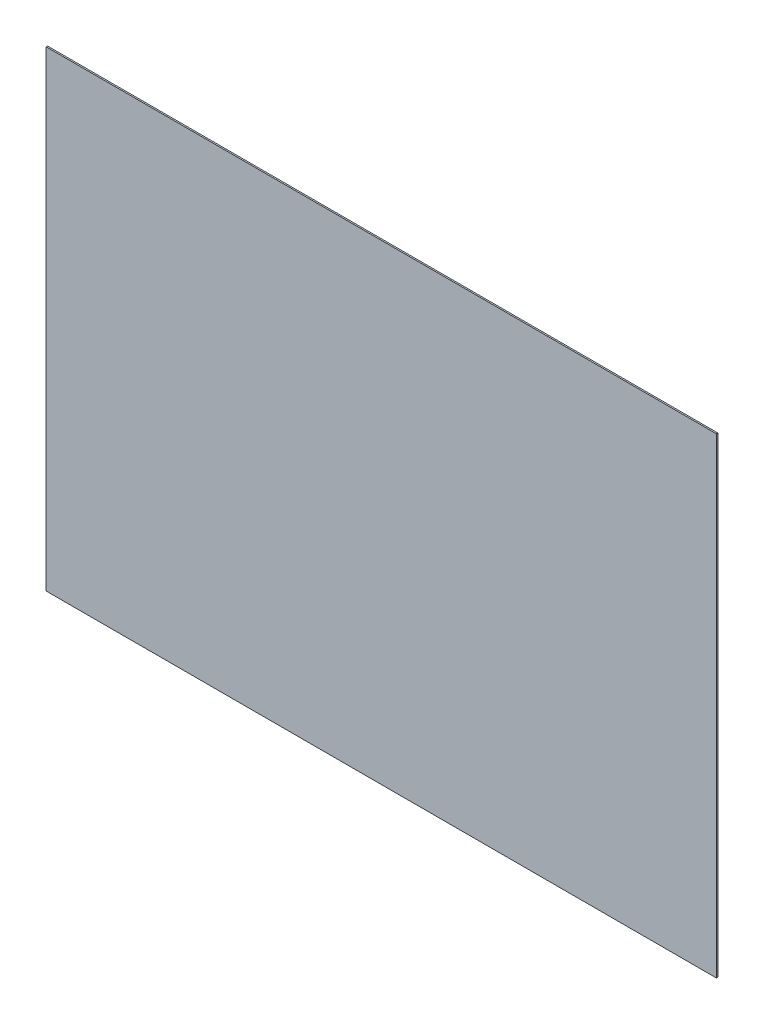
ISO-10303-21;
HEADER;
FILE_DESCRIPTION(('STEP AP214'),'2;1');
FILE_NAME('part.step','',(''),(''),'','','');
FILE_SCHEMA(('AUTOMOTIVE_DESIGN { 1 0 10303 214 1 1 1 1 }'));
ENDSEC;
DATA;
#1=APPLICATION_CONTEXT('core data for automotive mechanical design processes');
#2=APPLICATION_PROTOCOL_DEFINITION('international standard','automotive_design',2000,#1);
#3=PRODUCT_CONTEXT('',#1,'mechanical');
#4=PRODUCT('Part','Part','',(#3));
#5=PRODUCT_RELATED_PRODUCT_CATEGORY('part','',(#4));
#6=PRODUCT_DEFINITION_FORMATION('','',#4);
#7=PRODUCT_DEFINITION_CONTEXT('part definition',#1,'design');
#8=PRODUCT_DEFINITION('design','',#6,#7);
#9=PRODUCT_DEFINITION_SHAPE('','',#8);
#10=(LENGTH_UNIT() NAMED_UNIT(*) SI_UNIT(.MILLI.,.METRE.));
#11=(NAMED_UNIT(*) PLANE_ANGLE_UNIT() SI_UNIT($,.RADIAN.));
#12=(NAMED_UNIT(*) SI_UNIT($,.STERADIAN.) SOLID_ANGLE_UNIT());
#13=UNCERTAINTY_MEASURE_WITH_UNIT(LENGTH_MEASURE(1.E-05),#10,'distance_accuracy_value','');
#14=(GEOMETRIC_REPRESENTATION_CONTEXT(3) GLOBAL_UNCERTAINTY_ASSIGNED_CONTEXT((#13)) GLOBAL_UNIT_ASSIGNED_CONTEXT((#10,
#11,#12)) REPRESENTATION_CONTEXT('',''));
#15=CARTESIAN_POINT('',(0.,0.,0.));
#16=DIRECTION('',(0.,0.,1.));
#17=DIRECTION('',(1.,0.,0.));
#18=AXIS2_PLACEMENT_3D('',#15,#16,#17);
#19=CARTESIAN_POINT('',(54.8004201680672,254.254201680672,1.));
#20=DIRECTION('',(-1.,0.,0.));
#21=DIRECTION('',(0.,-1.,0.));
#22=AXIS2_PLACEMENT_3D('',#19,#20,#21);
#23=PLANE('',#22);
#24=DIRECTION('',(0.,1.,0.));
#25=VECTOR('',#24,1.);
#26=CARTESIAN_POINT('',(54.8004201680672,254.254201680672,0.));
#27=LINE('',#26,#25);
#28=CARTESIAN_POINT('',(54.8004201680672,-76.2457983193278,0.));
#29=VERTEX_POINT('',#28);
#30=CARTESIAN_POINT('',(54.8004201680672,254.254201680672,0.));
#31=VERTEX_POINT('',#30);
#32=EDGE_CURVE('E103',#29,#31,#27,.T.);
#33=ORIENTED_EDGE('',*,*,#32,.T.);
#34=DIRECTION('',(0.,0.,-1.));
#35=VECTOR('',#34,1.);
#36=CARTESIAN_POINT('',(54.8004201680672,254.254201680672,1.));
#37=LINE('',#36,#35);
#38=CARTESIAN_POINT('',(54.8004201680672,254.254201680672,1.));
#39=VERTEX_POINT('',#38);
#40=EDGE_CURVE('E11',#39,#31,#37,.T.);
#41=ORIENTED_EDGE('',*,*,#40,.F.);
#42=DIRECTION('',(0.,1.,0.));
#43=VECTOR('',#42,1.);
#44=CARTESIAN_POINT('',(54.8004201680672,254.254201680672,1.));
#45=LINE('',#44,#43);
#46=CARTESIAN_POINT('',(54.8004201680672,-76.2457983193278,1.));
#47=VERTEX_POINT('',#46);
#48=EDGE_CURVE('E91',#47,#39,#45,.T.);
#49=ORIENTED_EDGE('',*,*,#48,.F.);
#50=DIRECTION('',(0.,0.,-1.));
#51=VECTOR('',#50,1.);
#52=CARTESIAN_POINT('',(54.8004201680672,-76.2457983193278,1.));
#53=LINE('',#52,#51);
#54=EDGE_CURVE('E99',#47,#29,#53,.T.);
#55=ORIENTED_EDGE('',*,*,#54,.T.);
#56=EDGE_LOOP('',(#33,#41,#49,#55));
#57=FACE_BOUND('',#56,.T.);
#58=ADVANCED_FACE('F40',(#57),#23,.F.);
#59=CARTESIAN_POINT('',(-415.199579831933,254.254201680672,1.));
#60=DIRECTION('',(0.,-1.,0.));
#61=DIRECTION('',(0.,0.,-1.));
#62=AXIS2_PLACEMENT_3D('',#59,#60,#61);
#63=PLANE('',#62);
#64=DIRECTION('',(-1.,0.,0.));
#65=VECTOR('',#64,1.);
#66=CARTESIAN_POINT('',(-415.199579831933,254.254201680672,0.));
#67=LINE('',#66,#65);
#68=CARTESIAN_POINT('',(-415.199579831933,254.254201680672,0.));
#69=VERTEX_POINT('',#68);
#70=EDGE_CURVE('E95',#31,#69,#67,.T.);
#71=ORIENTED_EDGE('',*,*,#70,.T.);
#72=DIRECTION('',(0.,0.,-1.));
#73=VECTOR('',#72,1.);
#74=CARTESIAN_POINT('',(-415.199579831933,254.254201680672,1.));
#75=LINE('',#74,#73);
#76=CARTESIAN_POINT('',(-415.199579831933,254.254201680672,1.));
#77=VERTEX_POINT('',#76);
#78=EDGE_CURVE('E48',#77,#69,#75,.T.);
#79=ORIENTED_EDGE('',*,*,#78,.F.);
#80=DIRECTION('',(-1.,0.,0.));
#81=VECTOR('',#80,1.);
#82=CARTESIAN_POINT('',(-415.199579831933,254.254201680672,1.));
#83=LINE('',#82,#81);
#84=EDGE_CURVE('E86',#39,#77,#83,.T.);
#85=ORIENTED_EDGE('',*,*,#84,.F.);
#86=ORIENTED_EDGE('',*,*,#40,.T.);
#87=EDGE_LOOP('',(#71,#79,#85,#86));
#88=FACE_BOUND('',#87,.T.);
#89=ADVANCED_FACE('F94',(#88),#63,.F.);
#90=CARTESIAN_POINT('',(-415.199579831933,254.254201680672,1.));
#91=DIRECTION('',(1.,0.,0.));
#92=DIRECTION('',(0.,1.,0.));
#93=AXIS2_PLACEMENT_3D('',#90,#91,#92);
#94=PLANE('',#93);
#95=DIRECTION('',(0.,-1.,0.));
#96=VECTOR('',#95,1.);
#97=CARTESIAN_POINT('',(-415.199579831933,254.254201680672,0.));
#98=LINE('',#97,#96);
#99=CARTESIAN_POINT('',(-415.199579831933,-76.2457983193278,0.));
#100=VERTEX_POINT('',#99);
#101=EDGE_CURVE('E73',#69,#100,#98,.T.);
#102=ORIENTED_EDGE('',*,*,#101,.T.);
#103=DIRECTION('',(0.,0.,-1.));
#104=VECTOR('',#103,1.);
#105=CARTESIAN_POINT('',(-415.199579831933,-76.2457983193278,1.));
#106=LINE('',#105,#104);
#107=CARTESIAN_POINT('',(-415.199579831933,-76.2457983193278,1.));
#108=VERTEX_POINT('',#107);
#109=EDGE_CURVE('E96',#108,#100,#106,.T.);
#110=ORIENTED_EDGE('',*,*,#109,.F.);
#111=DIRECTION('',(0.,-1.,0.));
#112=VECTOR('',#111,1.);
#113=CARTESIAN_POINT('',(-415.199579831933,254.254201680672,1.));
#114=LINE('',#113,#112);
#115=EDGE_CURVE('E89',#77,#108,#114,.T.);
#116=ORIENTED_EDGE('',*,*,#115,.F.);
#117=ORIENTED_EDGE('',*,*,#78,.T.);
#118=EDGE_LOOP('',(#102,#110,#116,#117));
#119=FACE_BOUND('',#118,.T.);
#120=ADVANCED_FACE('F97',(#119),#94,.F.);
#121=CARTESIAN_POINT('',(-415.199579831933,-76.2457983193278,1.));
#122=DIRECTION('',(0.,1.,0.));
#123=DIRECTION('',(0.,0.,1.));
#124=AXIS2_PLACEMENT_3D('',#121,#122,#123);
#125=PLANE('',#124);
#126=DIRECTION('',(1.,0.,0.));
#127=VECTOR('',#126,1.);
#128=CARTESIAN_POINT('',(-415.199579831933,-76.2457983193278,0.));
#129=LINE('',#128,#127);
#130=EDGE_CURVE('E79',#100,#29,#129,.T.);
#131=ORIENTED_EDGE('',*,*,#130,.T.);
#132=ORIENTED_EDGE('',*,*,#54,.F.);
#133=DIRECTION('',(1.,0.,0.));
#134=VECTOR('',#133,1.);
#135=CARTESIAN_POINT('',(-415.199579831933,-76.2457983193278,1.));
#136=LINE('',#135,#134);
#137=EDGE_CURVE('E56',#108,#47,#136,.T.);
#138=ORIENTED_EDGE('',*,*,#137,.F.);
#139=ORIENTED_EDGE('',*,*,#109,.T.);
#140=EDGE_LOOP('',(#131,#132,#138,#139));
#141=FACE_BOUND('',#140,.T.);
#142=ADVANCED_FACE('F110',(#141),#125,.F.);
#143=CARTESIAN_POINT('',(0.,0.,1.));
#144=DIRECTION('',(0.,0.,1.));
#145=DIRECTION('',(1.,0.,0.));
#146=AXIS2_PLACEMENT_3D('',#143,#144,#145);
#147=PLANE('',#146);
#148=ORIENTED_EDGE('',*,*,#48,.T.);
#149=ORIENTED_EDGE('',*,*,#84,.T.);
#150=ORIENTED_EDGE('',*,*,#115,.T.);
#151=ORIENTED_EDGE('',*,*,#137,.T.);
#152=EDGE_LOOP('',(#148,#149,#150,#151));
#153=FACE_BOUND('',#152,.T.);
#154=ADVANCED_FACE('F87',(#153),#147,.T.);
#155=CARTESIAN_POINT('',(0.,0.,0.));
#156=DIRECTION('',(0.,0.,1.));
#157=DIRECTION('',(1.,0.,0.));
#158=AXIS2_PLACEMENT_3D('',#155,#156,#157);
#159=PLANE('',#158);
#160=ORIENTED_EDGE('',*,*,#32,.F.);
#161=ORIENTED_EDGE('',*,*,#130,.F.);
#162=ORIENTED_EDGE('',*,*,#101,.F.);
#163=ORIENTED_EDGE('',*,*,#70,.F.);
#164=EDGE_LOOP('',(#160,#161,#162,#163));
#165=FACE_BOUND('',#164,.T.);
#166=ADVANCED_FACE('F113',(#165),#159,.F.);
#167=CLOSED_SHELL('',(#58,#89,#120,#142,#154,#166));
#168=MANIFOLD_SOLID_BREP('B2',#167);
#169=ADVANCED_BREP_SHAPE_REPRESENTATION('',(#18,#168),#14);
#170=SHAPE_DEFINITION_REPRESENTATION(#9,#169);
ENDSEC;
END-ISO-10303-21;
